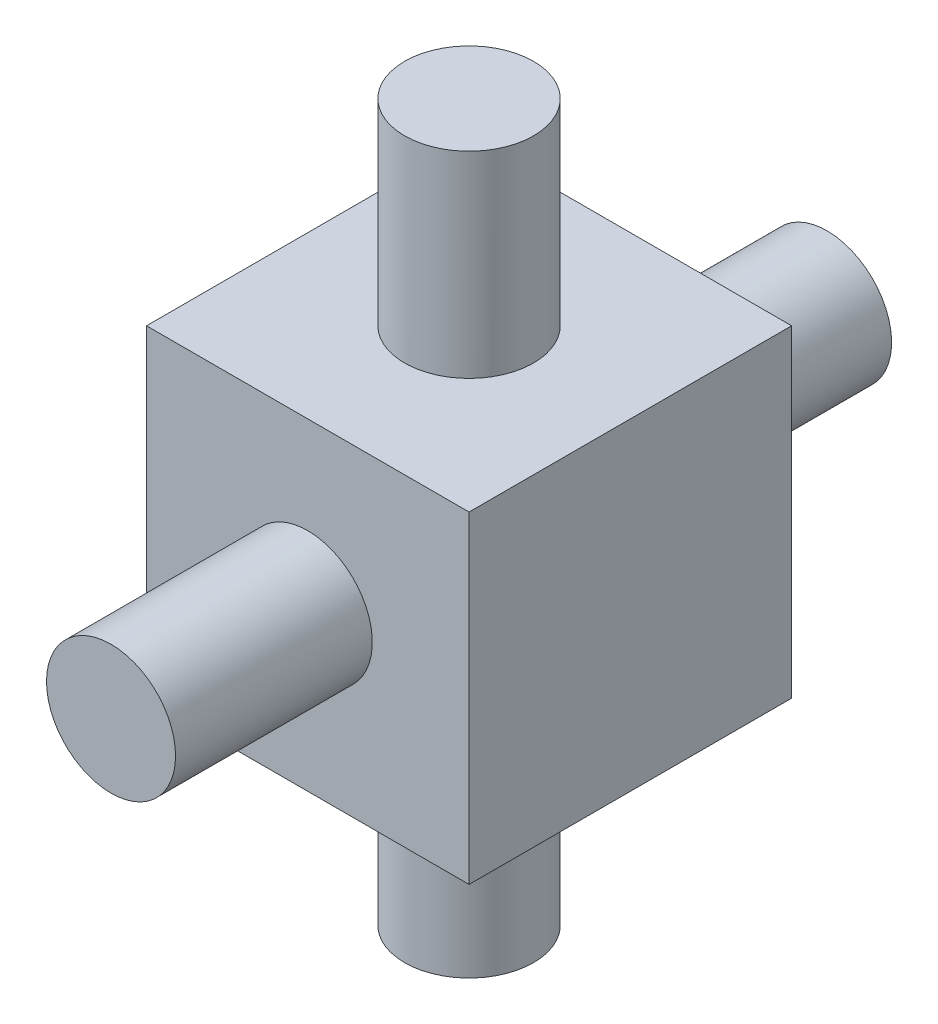
ISO-10303-21;
HEADER;
FILE_DESCRIPTION(('STEP AP214'),'2;1');
FILE_NAME('part.step','',(''),(''),'','','');
FILE_SCHEMA(('AUTOMOTIVE_DESIGN { 1 0 10303 214 1 1 1 1 }'));
ENDSEC;
DATA;
#1=APPLICATION_CONTEXT('core data for automotive mechanical design processes');
#2=APPLICATION_PROTOCOL_DEFINITION('international standard','automotive_design',2000,#1);
#3=PRODUCT_CONTEXT('',#1,'mechanical');
#4=PRODUCT('Part','Part','',(#3));
#5=PRODUCT_RELATED_PRODUCT_CATEGORY('part','',(#4));
#6=PRODUCT_DEFINITION_FORMATION('','',#4);
#7=PRODUCT_DEFINITION_CONTEXT('part definition',#1,'design');
#8=PRODUCT_DEFINITION('design','',#6,#7);
#9=PRODUCT_DEFINITION_SHAPE('','',#8);
#10=(LENGTH_UNIT() NAMED_UNIT(*) SI_UNIT(.MILLI.,.METRE.));
#11=(NAMED_UNIT(*) PLANE_ANGLE_UNIT() SI_UNIT($,.RADIAN.));
#12=(NAMED_UNIT(*) SI_UNIT($,.STERADIAN.) SOLID_ANGLE_UNIT());
#13=UNCERTAINTY_MEASURE_WITH_UNIT(LENGTH_MEASURE(1.E-05),#10,'distance_accuracy_value','');
#14=(GEOMETRIC_REPRESENTATION_CONTEXT(3) GLOBAL_UNCERTAINTY_ASSIGNED_CONTEXT((#13)) GLOBAL_UNIT_ASSIGNED_CONTEXT((#10,
#11,#12)) REPRESENTATION_CONTEXT('',''));
#15=CARTESIAN_POINT('',(0.,0.,0.));
#16=DIRECTION('',(0.,0.,1.));
#17=DIRECTION('',(1.,0.,0.));
#18=AXIS2_PLACEMENT_3D('',#15,#16,#17);
#19=CARTESIAN_POINT('',(0.,5.,0.));
#20=DIRECTION('',(0.,0.,-1.));
#21=DIRECTION('',(-1.,0.,0.));
#22=AXIS2_PLACEMENT_3D('',#19,#20,#21);
#23=PLANE('',#22);
#24=DIRECTION('',(0.,-1.,0.));
#25=VECTOR('',#24,1.);
#26=CARTESIAN_POINT('',(0.,0.,0.));
#27=LINE('',#26,#25);
#28=CARTESIAN_POINT('',(0.,5.,0.));
#29=VERTEX_POINT('',#28);
#30=CARTESIAN_POINT('',(0.,0.,0.));
#31=VERTEX_POINT('',#30);
#32=EDGE_CURVE('E103',#29,#31,#27,.T.);
#33=ORIENTED_EDGE('',*,*,#32,.F.);
#34=DIRECTION('',(-1.,0.,0.));
#35=VECTOR('',#34,1.);
#36=CARTESIAN_POINT('',(0.,5.,0.));
#37=LINE('',#36,#35);
#38=CARTESIAN_POINT('',(5.,5.,0.));
#39=VERTEX_POINT('',#38);
#40=EDGE_CURVE('E73',#39,#29,#37,.T.);
#41=ORIENTED_EDGE('',*,*,#40,.F.);
#42=DIRECTION('',(0.,1.,0.));
#43=VECTOR('',#42,1.);
#44=CARTESIAN_POINT('',(5.,0.,0.));
#45=LINE('',#44,#43);
#46=CARTESIAN_POINT('',(5.,0.,0.));
#47=VERTEX_POINT('',#46);
#48=EDGE_CURVE('E67',#47,#39,#45,.T.);
#49=ORIENTED_EDGE('',*,*,#48,.F.);
#50=DIRECTION('',(1.,0.,0.));
#51=VECTOR('',#50,1.);
#52=CARTESIAN_POINT('',(0.,0.,0.));
#53=LINE('',#52,#51);
#54=EDGE_CURVE('E93',#31,#47,#53,.T.);
#55=ORIENTED_EDGE('',*,*,#54,.F.);
#56=EDGE_LOOP('',(#33,#41,#49,#55));
#57=FACE_BOUND('',#56,.T.);
#58=CARTESIAN_POINT('',(2.5,2.5,0.));
#59=DIRECTION('',(0.,0.,-1.));
#60=DIRECTION('',(-1.,0.,0.));
#61=AXIS2_PLACEMENT_3D('',#58,#59,#60);
#62=CIRCLE('',#61,1.);
#63=CARTESIAN_POINT('',(1.5,2.5,0.));
#64=VERTEX_POINT('',#63);
#65=EDGE_CURVE('E160',#64,#64,#62,.T.);
#66=ORIENTED_EDGE('',*,*,#65,.F.);
#67=EDGE_LOOP('',(#66));
#68=FACE_BOUND('',#67,.T.);
#69=ADVANCED_FACE('F33',(#57,#68),#23,.T.);
#70=CARTESIAN_POINT('',(0.,5.,5.));
#71=DIRECTION('',(0.,0.,-1.));
#72=DIRECTION('',(-1.,0.,0.));
#73=AXIS2_PLACEMENT_3D('',#70,#71,#72);
#74=PLANE('',#73);
#75=DIRECTION('',(0.,-1.,0.));
#76=VECTOR('',#75,1.);
#77=CARTESIAN_POINT('',(0.,0.,5.));
#78=LINE('',#77,#76);
#79=CARTESIAN_POINT('',(0.,5.,5.));
#80=VERTEX_POINT('',#79);
#81=CARTESIAN_POINT('',(0.,0.,5.));
#82=VERTEX_POINT('',#81);
#83=EDGE_CURVE('E87',#80,#82,#78,.T.);
#84=ORIENTED_EDGE('',*,*,#83,.T.);
#85=DIRECTION('',(1.,0.,0.));
#86=VECTOR('',#85,1.);
#87=CARTESIAN_POINT('',(0.,0.,5.));
#88=LINE('',#87,#86);
#89=CARTESIAN_POINT('',(5.,0.,5.));
#90=VERTEX_POINT('',#89);
#91=EDGE_CURVE('E81',#82,#90,#88,.T.);
#92=ORIENTED_EDGE('',*,*,#91,.T.);
#93=DIRECTION('',(0.,1.,0.));
#94=VECTOR('',#93,1.);
#95=CARTESIAN_POINT('',(5.,0.,5.));
#96=LINE('',#95,#94);
#97=CARTESIAN_POINT('',(5.,5.,5.));
#98=VERTEX_POINT('',#97);
#99=EDGE_CURVE('E85',#90,#98,#96,.T.);
#100=ORIENTED_EDGE('',*,*,#99,.T.);
#101=DIRECTION('',(-1.,0.,0.));
#102=VECTOR('',#101,1.);
#103=CARTESIAN_POINT('',(0.,5.,5.));
#104=LINE('',#103,#102);
#105=EDGE_CURVE('E50',#98,#80,#104,.T.);
#106=ORIENTED_EDGE('',*,*,#105,.T.);
#107=EDGE_LOOP('',(#84,#92,#100,#106));
#108=FACE_BOUND('',#107,.T.);
#109=CARTESIAN_POINT('',(2.5,2.5,5.));
#110=DIRECTION('',(0.,0.,-1.));
#111=DIRECTION('',(-1.,0.,0.));
#112=AXIS2_PLACEMENT_3D('',#109,#110,#111);
#113=CIRCLE('',#112,1.);
#114=CARTESIAN_POINT('',(1.5,2.5,5.));
#115=VERTEX_POINT('',#114);
#116=EDGE_CURVE('E11',#115,#115,#113,.F.);
#117=ORIENTED_EDGE('',*,*,#116,.F.);
#118=EDGE_LOOP('',(#117));
#119=FACE_BOUND('',#118,.T.);
#120=ADVANCED_FACE('F82',(#108,#119),#74,.F.);
#121=CARTESIAN_POINT('',(0.,0.,5.));
#122=DIRECTION('',(0.,1.,0.));
#123=DIRECTION('',(0.,0.,1.));
#124=AXIS2_PLACEMENT_3D('',#121,#122,#123);
#125=PLANE('',#124);
#126=ORIENTED_EDGE('',*,*,#54,.T.);
#127=DIRECTION('',(0.,0.,-1.));
#128=VECTOR('',#127,1.);
#129=CARTESIAN_POINT('',(5.,0.,5.));
#130=LINE('',#129,#128);
#131=EDGE_CURVE('E90',#90,#47,#130,.T.);
#132=ORIENTED_EDGE('',*,*,#131,.F.);
#133=ORIENTED_EDGE('',*,*,#91,.F.);
#134=DIRECTION('',(0.,0.,-1.));
#135=VECTOR('',#134,1.);
#136=CARTESIAN_POINT('',(0.,0.,5.));
#137=LINE('',#136,#135);
#138=EDGE_CURVE('E94',#82,#31,#137,.T.);
#139=ORIENTED_EDGE('',*,*,#138,.T.);
#140=EDGE_LOOP('',(#126,#132,#133,#139));
#141=FACE_BOUND('',#140,.T.);
#142=CARTESIAN_POINT('',(2.5,0.,2.5));
#143=DIRECTION('',(0.,1.,0.));
#144=DIRECTION('',(0.,0.,1.));
#145=AXIS2_PLACEMENT_3D('',#142,#143,#144);
#146=CIRCLE('',#145,1.);
#147=CARTESIAN_POINT('',(2.5,0.,3.5));
#148=VERTEX_POINT('',#147);
#149=EDGE_CURVE('E42',#148,#148,#146,.F.);
#150=ORIENTED_EDGE('',*,*,#149,.F.);
#151=EDGE_LOOP('',(#150));
#152=FACE_BOUND('',#151,.T.);
#153=ADVANCED_FACE('F91',(#141,#152),#125,.F.);
#154=CARTESIAN_POINT('',(0.,5.,5.));
#155=DIRECTION('',(0.,-1.,0.));
#156=DIRECTION('',(0.,0.,-1.));
#157=AXIS2_PLACEMENT_3D('',#154,#155,#156);
#158=PLANE('',#157);
#159=ORIENTED_EDGE('',*,*,#40,.T.);
#160=DIRECTION('',(0.,0.,-1.));
#161=VECTOR('',#160,1.);
#162=CARTESIAN_POINT('',(0.,5.,5.));
#163=LINE('',#162,#161);
#164=EDGE_CURVE('E99',#80,#29,#163,.T.);
#165=ORIENTED_EDGE('',*,*,#164,.F.);
#166=ORIENTED_EDGE('',*,*,#105,.F.);
#167=DIRECTION('',(0.,0.,-1.));
#168=VECTOR('',#167,1.);
#169=CARTESIAN_POINT('',(5.,5.,5.));
#170=LINE('',#169,#168);
#171=EDGE_CURVE('E95',#98,#39,#170,.T.);
#172=ORIENTED_EDGE('',*,*,#171,.T.);
#173=EDGE_LOOP('',(#159,#165,#166,#172));
#174=FACE_BOUND('',#173,.T.);
#175=CARTESIAN_POINT('',(2.5,5.,2.5));
#176=DIRECTION('',(0.,-1.,0.));
#177=DIRECTION('',(0.,0.,-1.));
#178=AXIS2_PLACEMENT_3D('',#175,#176,#177);
#179=CIRCLE('',#178,1.);
#180=CARTESIAN_POINT('',(2.5,5.,1.5));
#181=VERTEX_POINT('',#180);
#182=EDGE_CURVE('E113',#181,#181,#179,.F.);
#183=ORIENTED_EDGE('',*,*,#182,.F.);
#184=EDGE_LOOP('',(#183));
#185=FACE_BOUND('',#184,.T.);
#186=ADVANCED_FACE('F120',(#174,#185),#158,.F.);
#187=CARTESIAN_POINT('',(0.,0.,5.));
#188=DIRECTION('',(1.,0.,0.));
#189=DIRECTION('',(0.,0.,-1.));
#190=AXIS2_PLACEMENT_3D('',#187,#188,#189);
#191=PLANE('',#190);
#192=ORIENTED_EDGE('',*,*,#32,.T.);
#193=ORIENTED_EDGE('',*,*,#138,.F.);
#194=ORIENTED_EDGE('',*,*,#83,.F.);
#195=ORIENTED_EDGE('',*,*,#164,.T.);
#196=EDGE_LOOP('',(#192,#193,#194,#195));
#197=FACE_BOUND('',#196,.T.);
#198=ADVANCED_FACE('F35',(#197),#191,.F.);
#199=CARTESIAN_POINT('',(5.,0.,5.));
#200=DIRECTION('',(-1.,0.,0.));
#201=DIRECTION('',(0.,-1.,0.));
#202=AXIS2_PLACEMENT_3D('',#199,#200,#201);
#203=PLANE('',#202);
#204=ORIENTED_EDGE('',*,*,#48,.T.);
#205=ORIENTED_EDGE('',*,*,#171,.F.);
#206=ORIENTED_EDGE('',*,*,#99,.F.);
#207=ORIENTED_EDGE('',*,*,#131,.T.);
#208=EDGE_LOOP('',(#204,#205,#206,#207));
#209=FACE_BOUND('',#208,.T.);
#210=ADVANCED_FACE('F97',(#209),#203,.F.);
#211=CARTESIAN_POINT('',(2.5,8.05,2.5));
#212=DIRECTION('',(0.,-1.,0.));
#213=DIRECTION('',(0.,0.,-1.));
#214=AXIS2_PLACEMENT_3D('',#211,#212,#213);
#215=CYLINDRICAL_SURFACE('',#214,1.);
#216=CARTESIAN_POINT('',(2.5,8.05,2.5));
#217=DIRECTION('',(0.,1.,0.));
#218=DIRECTION('',(0.,0.,1.));
#219=AXIS2_PLACEMENT_3D('',#216,#217,#218);
#220=CIRCLE('',#219,1.);
#221=CARTESIAN_POINT('',(2.5,8.05,3.5));
#222=VERTEX_POINT('',#221);
#223=EDGE_CURVE('E106',#222,#222,#220,.T.);
#224=ORIENTED_EDGE('',*,*,#223,.F.);
#225=EDGE_LOOP('',(#224));
#226=FACE_BOUND('',#225,.T.);
#227=ORIENTED_EDGE('',*,*,#182,.T.);
#228=EDGE_LOOP('',(#227));
#229=FACE_BOUND('',#228,.T.);
#230=ADVANCED_FACE('F137',(#226,#229),#215,.T.);
#231=CARTESIAN_POINT('',(2.5,8.05,2.5));
#232=DIRECTION('',(0.,1.,0.));
#233=DIRECTION('',(0.,0.,1.));
#234=AXIS2_PLACEMENT_3D('',#231,#232,#233);
#235=PLANE('',#234);
#236=ORIENTED_EDGE('',*,*,#223,.T.);
#237=EDGE_LOOP('',(#236));
#238=FACE_BOUND('',#237,.T.);
#239=ADVANCED_FACE('F142',(#238),#235,.T.);
#240=CARTESIAN_POINT('',(2.5,-3.05,2.5));
#241=DIRECTION('',(0.,1.,0.));
#242=DIRECTION('',(0.,0.,1.));
#243=AXIS2_PLACEMENT_3D('',#240,#241,#242);
#244=CYLINDRICAL_SURFACE('',#243,1.);
#245=CARTESIAN_POINT('',(2.5,-3.05,2.5));
#246=DIRECTION('',(0.,-1.,0.));
#247=DIRECTION('',(0.,0.,-1.));
#248=AXIS2_PLACEMENT_3D('',#245,#246,#247);
#249=CIRCLE('',#248,1.);
#250=CARTESIAN_POINT('',(2.5,-3.05,1.5));
#251=VERTEX_POINT('',#250);
#252=EDGE_CURVE('E153',#251,#251,#249,.T.);
#253=ORIENTED_EDGE('',*,*,#252,.F.);
#254=EDGE_LOOP('',(#253));
#255=FACE_BOUND('',#254,.T.);
#256=ORIENTED_EDGE('',*,*,#149,.T.);
#257=EDGE_LOOP('',(#256));
#258=FACE_BOUND('',#257,.T.);
#259=ADVANCED_FACE('F118',(#255,#258),#244,.T.);
#260=CARTESIAN_POINT('',(2.5,-3.05,2.5));
#261=DIRECTION('',(0.,-1.,0.));
#262=DIRECTION('',(0.,0.,-1.));
#263=AXIS2_PLACEMENT_3D('',#260,#261,#262);
#264=PLANE('',#263);
#265=ORIENTED_EDGE('',*,*,#252,.T.);
#266=EDGE_LOOP('',(#265));
#267=FACE_BOUND('',#266,.T.);
#268=ADVANCED_FACE('F185',(#267),#264,.T.);
#269=CARTESIAN_POINT('',(2.5,2.5,8.05));
#270=DIRECTION('',(0.,0.,-1.));
#271=DIRECTION('',(-1.,0.,0.));
#272=AXIS2_PLACEMENT_3D('',#269,#270,#271);
#273=CYLINDRICAL_SURFACE('',#272,1.);
#274=CARTESIAN_POINT('',(2.5,2.5,8.05));
#275=DIRECTION('',(0.,0.,1.));
#276=DIRECTION('',(1.,0.,0.));
#277=AXIS2_PLACEMENT_3D('',#274,#275,#276);
#278=CIRCLE('',#277,1.);
#279=CARTESIAN_POINT('',(3.5,2.5,8.05));
#280=VERTEX_POINT('',#279);
#281=EDGE_CURVE('E156',#280,#280,#278,.T.);
#282=ORIENTED_EDGE('',*,*,#281,.F.);
#283=EDGE_LOOP('',(#282));
#284=FACE_BOUND('',#283,.T.);
#285=ORIENTED_EDGE('',*,*,#116,.T.);
#286=EDGE_LOOP('',(#285));
#287=FACE_BOUND('',#286,.T.);
#288=ADVANCED_FACE('F179',(#284,#287),#273,.T.);
#289=CARTESIAN_POINT('',(2.5,2.5,8.05));
#290=DIRECTION('',(0.,0.,1.));
#291=DIRECTION('',(1.,0.,0.));
#292=AXIS2_PLACEMENT_3D('',#289,#290,#291);
#293=PLANE('',#292);
#294=ORIENTED_EDGE('',*,*,#281,.T.);
#295=EDGE_LOOP('',(#294));
#296=FACE_BOUND('',#295,.T.);
#297=ADVANCED_FACE('F171',(#296),#293,.T.);
#298=CARTESIAN_POINT('',(2.5,2.5,-3.05));
#299=DIRECTION('',(0.,0.,1.));
#300=DIRECTION('',(1.,0.,0.));
#301=AXIS2_PLACEMENT_3D('',#298,#299,#300);
#302=CYLINDRICAL_SURFACE('',#301,1.);
#303=CARTESIAN_POINT('',(2.5,2.5,-3.05));
#304=DIRECTION('',(0.,0.,-1.));
#305=DIRECTION('',(-1.,0.,0.));
#306=AXIS2_PLACEMENT_3D('',#303,#304,#305);
#307=CIRCLE('',#306,1.);
#308=CARTESIAN_POINT('',(1.5,2.5,-3.05));
#309=VERTEX_POINT('',#308);
#310=EDGE_CURVE('E159',#309,#309,#307,.T.);
#311=ORIENTED_EDGE('',*,*,#310,.F.);
#312=EDGE_LOOP('',(#311));
#313=FACE_BOUND('',#312,.T.);
#314=ORIENTED_EDGE('',*,*,#65,.T.);
#315=EDGE_LOOP('',(#314));
#316=FACE_BOUND('',#315,.T.);
#317=ADVANCED_FACE('F168',(#313,#316),#302,.T.);
#318=CARTESIAN_POINT('',(2.5,2.5,-3.05));
#319=DIRECTION('',(0.,0.,-1.));
#320=DIRECTION('',(-1.,0.,0.));
#321=AXIS2_PLACEMENT_3D('',#318,#319,#320);
#322=PLANE('',#321);
#323=ORIENTED_EDGE('',*,*,#310,.T.);
#324=EDGE_LOOP('',(#323));
#325=FACE_BOUND('',#324,.T.);
#326=ADVANCED_FACE('F166',(#325),#322,.T.);
#327=CLOSED_SHELL('',(#69,#120,#153,#186,#198,#210,#230,#239,#259,#268,#288,#297,#317,#326));
#328=MANIFOLD_SOLID_BREP('B2',#327);
#329=ADVANCED_BREP_SHAPE_REPRESENTATION('',(#18,#328),#14);
#330=SHAPE_DEFINITION_REPRESENTATION(#9,#329);
ENDSEC;
END-ISO-10303-21;
